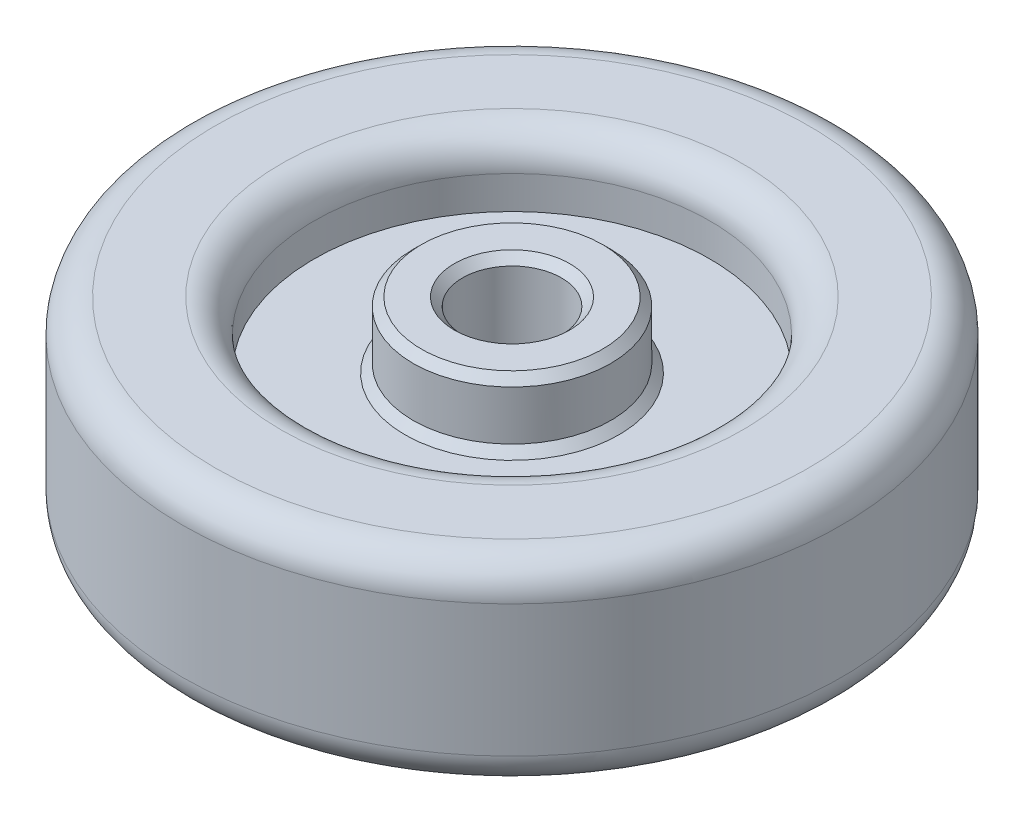
ISO-10303-21;
HEADER;
FILE_DESCRIPTION(('STEP AP214'),'2;1');
FILE_NAME('part.step','',(''),(''),'','','');
FILE_SCHEMA(('AUTOMOTIVE_DESIGN { 1 0 10303 214 1 1 1 1 }'));
ENDSEC;
DATA;
#1=APPLICATION_CONTEXT('core data for automotive mechanical design processes');
#2=APPLICATION_PROTOCOL_DEFINITION('international standard','automotive_design',2000,#1);
#3=PRODUCT_CONTEXT('',#1,'mechanical');
#4=PRODUCT('Part','Part','',(#3));
#5=PRODUCT_RELATED_PRODUCT_CATEGORY('part','',(#4));
#6=PRODUCT_DEFINITION_FORMATION('','',#4);
#7=PRODUCT_DEFINITION_CONTEXT('part definition',#1,'design');
#8=PRODUCT_DEFINITION('design','',#6,#7);
#9=PRODUCT_DEFINITION_SHAPE('','',#8);
#10=(LENGTH_UNIT() NAMED_UNIT(*) SI_UNIT(.MILLI.,.METRE.));
#11=(NAMED_UNIT(*) PLANE_ANGLE_UNIT() SI_UNIT($,.RADIAN.));
#12=(NAMED_UNIT(*) SI_UNIT($,.STERADIAN.) SOLID_ANGLE_UNIT());
#13=UNCERTAINTY_MEASURE_WITH_UNIT(LENGTH_MEASURE(1.E-05),#10,'distance_accuracy_value','');
#14=(GEOMETRIC_REPRESENTATION_CONTEXT(3) GLOBAL_UNCERTAINTY_ASSIGNED_CONTEXT((#13)) GLOBAL_UNIT_ASSIGNED_CONTEXT((#10,
#11,#12)) REPRESENTATION_CONTEXT('',''));
#15=CARTESIAN_POINT('',(0.,0.,0.));
#16=DIRECTION('',(0.,0.,1.));
#17=DIRECTION('',(1.,0.,0.));
#18=AXIS2_PLACEMENT_3D('',#15,#16,#17);
#19=CARTESIAN_POINT('',(0.,9.525,0.));
#20=DIRECTION('',(0.,-1.,0.));
#21=DIRECTION('',(0.,0.,-1.));
#22=AXIS2_PLACEMENT_3D('',#19,#20,#21);
#23=CYLINDRICAL_SURFACE('',#22,15.875);
#24=CARTESIAN_POINT('',(0.,1.5875,0.));
#25=DIRECTION('',(0.,1.,0.));
#26=DIRECTION('',(0.,0.,1.));
#27=AXIS2_PLACEMENT_3D('',#24,#25,#26);
#28=CIRCLE('',#27,15.875);
#29=CARTESIAN_POINT('',(0.,1.5875,-15.875));
#30=VERTEX_POINT('',#29);
#31=EDGE_CURVE('E98',#30,#30,#28,.T.);
#32=CARTESIAN_POINT('',(0.,7.9375,0.));
#33=DIRECTION('',(0.,1.,0.));
#34=DIRECTION('',(0.,0.,1.));
#35=AXIS2_PLACEMENT_3D('',#32,#33,#34);
#36=CIRCLE('',#35,15.875);
#37=CARTESIAN_POINT('',(0.,7.9375,-15.875));
#38=VERTEX_POINT('',#37);
#39=EDGE_CURVE('E102',#38,#38,#36,.F.);
#40=CARTESIAN_POINT('',(0.,1.5875,-15.875));
#41=CARTESIAN_POINT('',(0.,1.65364583333333,-15.875));
#42=CARTESIAN_POINT('',(0.,1.71979166666666,-15.875));
#43=CARTESIAN_POINT('',(0.,1.85208333333333,-15.875));
#44=CARTESIAN_POINT('',(0.,1.91822916666666,-15.875));
#45=CARTESIAN_POINT('',(0.,2.05052083333333,-15.875));
#46=CARTESIAN_POINT('',(0.,2.11666666666666,-15.875));
#47=CARTESIAN_POINT('',(0.,2.24895833333333,-15.875));
#48=CARTESIAN_POINT('',(0.,2.31510416666666,-15.875));
#49=CARTESIAN_POINT('',(0.,2.44739583333333,-15.875));
#50=CARTESIAN_POINT('',(0.,2.51354166666666,-15.875));
#51=CARTESIAN_POINT('',(0.,2.64583333333333,-15.875));
#52=CARTESIAN_POINT('',(0.,2.71197916666667,-15.875));
#53=CARTESIAN_POINT('',(0.,2.84427083333333,-15.875));
#54=CARTESIAN_POINT('',(0.,2.91041666666667,-15.875));
#55=CARTESIAN_POINT('',(0.,3.04270833333333,-15.875));
#56=CARTESIAN_POINT('',(0.,3.10885416666666,-15.875));
#57=CARTESIAN_POINT('',(0.,3.24114583333333,-15.875));
#58=CARTESIAN_POINT('',(0.,3.30729166666666,-15.875));
#59=CARTESIAN_POINT('',(0.,3.43958333333333,-15.875));
#60=CARTESIAN_POINT('',(0.,3.50572916666666,-15.875));
#61=CARTESIAN_POINT('',(0.,3.63802083333333,-15.875));
#62=CARTESIAN_POINT('',(0.,3.70416666666667,-15.875));
#63=CARTESIAN_POINT('',(0.,3.83645833333333,-15.875));
#64=CARTESIAN_POINT('',(0.,3.90260416666667,-15.875));
#65=CARTESIAN_POINT('',(0.,4.03489583333333,-15.875));
#66=CARTESIAN_POINT('',(0.,4.10104166666667,-15.875));
#67=CARTESIAN_POINT('',(0.,4.23333333333333,-15.875));
#68=CARTESIAN_POINT('',(0.,4.29947916666667,-15.875));
#69=CARTESIAN_POINT('',(0.,4.43177083333333,-15.875));
#70=CARTESIAN_POINT('',(0.,4.49791666666667,-15.875));
#71=CARTESIAN_POINT('',(0.,4.63020833333333,-15.875));
#72=CARTESIAN_POINT('',(0.,4.69635416666667,-15.875));
#73=CARTESIAN_POINT('',(0.,4.82864583333333,-15.875));
#74=CARTESIAN_POINT('',(0.,4.89479166666667,-15.875));
#75=CARTESIAN_POINT('',(0.,5.02708333333333,-15.875));
#76=CARTESIAN_POINT('',(0.,5.09322916666667,-15.875));
#77=CARTESIAN_POINT('',(0.,5.22552083333333,-15.875));
#78=CARTESIAN_POINT('',(0.,5.29166666666667,-15.875));
#79=CARTESIAN_POINT('',(0.,5.42395833333333,-15.875));
#80=CARTESIAN_POINT('',(0.,5.49010416666667,-15.875));
#81=CARTESIAN_POINT('',(0.,5.62239583333333,-15.875));
#82=CARTESIAN_POINT('',(0.,5.68854166666666,-15.875));
#83=CARTESIAN_POINT('',(0.,5.82083333333333,-15.875));
#84=CARTESIAN_POINT('',(0.,5.88697916666666,-15.875));
#85=CARTESIAN_POINT('',(0.,6.01927083333333,-15.875));
#86=CARTESIAN_POINT('',(0.,6.08541666666667,-15.875));
#87=CARTESIAN_POINT('',(0.,6.21770833333333,-15.875));
#88=CARTESIAN_POINT('',(0.,6.28385416666667,-15.875));
#89=CARTESIAN_POINT('',(0.,6.41614583333333,-15.875));
#90=CARTESIAN_POINT('',(0.,6.48229166666667,-15.875));
#91=CARTESIAN_POINT('',(0.,6.61458333333333,-15.875));
#92=CARTESIAN_POINT('',(0.,6.68072916666666,-15.875));
#93=CARTESIAN_POINT('',(0.,6.81302083333333,-15.875));
#94=CARTESIAN_POINT('',(0.,6.87916666666666,-15.875));
#95=CARTESIAN_POINT('',(0.,7.01145833333333,-15.875));
#96=CARTESIAN_POINT('',(0.,7.07760416666667,-15.875));
#97=CARTESIAN_POINT('',(0.,7.20989583333333,-15.875));
#98=CARTESIAN_POINT('',(0.,7.27604166666667,-15.875));
#99=CARTESIAN_POINT('',(0.,7.40833333333333,-15.875));
#100=CARTESIAN_POINT('',(0.,7.47447916666667,-15.875));
#101=CARTESIAN_POINT('',(0.,7.60677083333333,-15.875));
#102=CARTESIAN_POINT('',(0.,7.67291666666667,-15.875));
#103=CARTESIAN_POINT('',(0.,7.80520833333333,-15.875));
#104=CARTESIAN_POINT('',(0.,7.87135416666667,-15.875));
#105=CARTESIAN_POINT('',(0.,7.9375,-15.875));
#106=B_SPLINE_CURVE_WITH_KNOTS('',3,(#40,#41,#42,#43,#44,#45,#46,#47,#48,#49,#50,#51,#52,#53,
#54,#55,#56,#57,#58,#59,#60,#61,#62,#63,#64,#65,#66,#67,#68,#69,#70,#71,#72,#73,#74,#75,#76,#77,
#78,#79,#80,#81,#82,#83,#84,#85,#86,#87,#88,#89,#90,#91,#92,#93,#94,#95,#96,#97,#98,#99,#100,
#101,#102,#103,#104,#105),.UNSPECIFIED.,.F.,.F.,(4,2,2,2,2,2,2,2,2,2,2,2,2,2,2,2,2,2,2,2,2,2,2,
2,2,2,2,2,2,2,2,2,4),(0.,0.198437499999999,0.396874999999999,0.595312499999999,
0.793749999999999,0.992187499999999,1.190625,1.3890625,1.5875,1.7859375,1.984375,2.1828125,
2.38125,2.5796875,2.778125,2.9765625,3.175,3.3734375,3.571875,3.7703125,3.96875,4.1671875,
4.365625,4.5640625,4.7625,4.9609375,5.159375,5.3578125,5.55625,5.7546875,5.953125,6.1515625,
6.35),.UNSPECIFIED.);
#107=EDGE_CURVE('BSEAM41',#30,#38,#106,.T.);
#108=ORIENTED_EDGE('',*,*,#31,.T.);
#109=ORIENTED_EDGE('',*,*,#39,.T.);
#110=ORIENTED_EDGE('',*,*,#107,.T.);
#111=ORIENTED_EDGE('',*,*,#107,.F.);
#112=EDGE_LOOP('',(#108,#110,#109,#111));
#113=FACE_BOUND('',#112,.T.);
#114=ADVANCED_FACE('F41',(#113),#23,.T.);
#115=CARTESIAN_POINT('',(0.,9.525,0.));
#116=DIRECTION('',(0.,1.,0.));
#117=DIRECTION('',(0.,0.,1.));
#118=AXIS2_PLACEMENT_3D('',#115,#116,#117);
#119=PLANE('',#118);
#120=CARTESIAN_POINT('',(0.,9.525,0.));
#121=DIRECTION('',(0.,1.,0.));
#122=DIRECTION('',(0.,0.,1.));
#123=AXIS2_PLACEMENT_3D('',#120,#121,#122);
#124=CIRCLE('',#123,14.2875);
#125=CARTESIAN_POINT('',(0.,9.525,14.2875));
#126=VERTEX_POINT('',#125);
#127=EDGE_CURVE('E86',#126,#126,#124,.T.);
#128=ORIENTED_EDGE('',*,*,#127,.T.);
#129=EDGE_LOOP('',(#128));
#130=FACE_BOUND('',#129,.T.);
#131=CARTESIAN_POINT('',(0.,9.525,0.));
#132=DIRECTION('',(0.,1.,0.));
#133=DIRECTION('',(0.,0.,1.));
#134=AXIS2_PLACEMENT_3D('',#131,#132,#133);
#135=CIRCLE('',#134,11.1125);
#136=CARTESIAN_POINT('',(0.,9.525,11.1125));
#137=VERTEX_POINT('',#136);
#138=EDGE_CURVE('E90',#137,#137,#135,.F.);
#139=ORIENTED_EDGE('',*,*,#138,.T.);
#140=EDGE_LOOP('',(#139));
#141=FACE_BOUND('',#140,.T.);
#142=ADVANCED_FACE('F124',(#130,#141),#119,.T.);
#143=CARTESIAN_POINT('',(0.,0.,0.));
#144=DIRECTION('',(0.,1.,0.));
#145=DIRECTION('',(0.,0.,1.));
#146=AXIS2_PLACEMENT_3D('',#143,#144,#145);
#147=PLANE('',#146);
#148=CARTESIAN_POINT('',(0.,0.,0.));
#149=DIRECTION('',(0.,1.,0.));
#150=DIRECTION('',(0.,0.,1.));
#151=AXIS2_PLACEMENT_3D('',#148,#149,#150);
#152=CIRCLE('',#151,2.77812499999999);
#153=CARTESIAN_POINT('',(0.,0.,2.77812499999999));
#154=VERTEX_POINT('',#153);
#155=EDGE_CURVE('E78',#154,#154,#152,.T.);
#156=ORIENTED_EDGE('',*,*,#155,.T.);
#157=EDGE_LOOP('',(#156));
#158=FACE_BOUND('',#157,.T.);
#159=CARTESIAN_POINT('',(0.,0.,0.));
#160=DIRECTION('',(0.,1.,0.));
#161=DIRECTION('',(0.,0.,1.));
#162=AXIS2_PLACEMENT_3D('',#159,#160,#161);
#163=CIRCLE('',#162,14.2875);
#164=CARTESIAN_POINT('',(0.,0.,14.2875));
#165=VERTEX_POINT('',#164);
#166=EDGE_CURVE('E94',#165,#165,#163,.F.);
#167=ORIENTED_EDGE('',*,*,#166,.T.);
#168=EDGE_LOOP('',(#167));
#169=FACE_BOUND('',#168,.T.);
#170=ADVANCED_FACE('F115',(#158,#169),#147,.F.);
#171=CARTESIAN_POINT('',(0.,6.35,0.));
#172=DIRECTION('',(0.,1.,0.));
#173=DIRECTION('',(0.,0.,1.));
#174=AXIS2_PLACEMENT_3D('',#171,#172,#173);
#175=CYLINDRICAL_SURFACE('',#174,9.525);
#176=CARTESIAN_POINT('',(0.,7.9375,0.));
#177=DIRECTION('',(0.,1.,0.));
#178=DIRECTION('',(0.,0.,1.));
#179=AXIS2_PLACEMENT_3D('',#176,#177,#178);
#180=CIRCLE('',#179,9.525);
#181=CARTESIAN_POINT('',(0.,7.9375,9.525));
#182=VERTEX_POINT('',#181);
#183=EDGE_CURVE('E82',#182,#182,#180,.T.);
#184=ORIENTED_EDGE('',*,*,#183,.T.);
#185=EDGE_LOOP('',(#184));
#186=FACE_BOUND('',#185,.T.);
#187=CARTESIAN_POINT('',(0.,6.35,0.));
#188=DIRECTION('',(0.,1.,0.));
#189=DIRECTION('',(0.,0.,1.));
#190=AXIS2_PLACEMENT_3D('',#187,#188,#189);
#191=CIRCLE('',#190,9.525);
#192=CARTESIAN_POINT('',(0.,6.35,9.525));
#193=VERTEX_POINT('',#192);
#194=EDGE_CURVE('E106',#193,#193,#191,.T.);
#195=ORIENTED_EDGE('',*,*,#194,.F.);
#196=EDGE_LOOP('',(#195));
#197=FACE_BOUND('',#196,.T.);
#198=ADVANCED_FACE('F113',(#186,#197),#175,.F.);
#199=CARTESIAN_POINT('',(0.,6.35,0.));
#200=DIRECTION('',(0.,1.,0.));
#201=DIRECTION('',(0.,0.,1.));
#202=AXIS2_PLACEMENT_3D('',#199,#200,#201);
#203=PLANE('',#202);
#204=CARTESIAN_POINT('',(0.,6.35,0.));
#205=DIRECTION('',(0.,1.,0.));
#206=DIRECTION('',(0.,0.,1.));
#207=AXIS2_PLACEMENT_3D('',#204,#205,#206);
#208=CIRCLE('',#207,5.159375);
#209=CARTESIAN_POINT('',(0.,6.35,5.159375));
#210=VERTEX_POINT('',#209);
#211=EDGE_CURVE('E10',#210,#210,#208,.F.);
#212=ORIENTED_EDGE('',*,*,#211,.T.);
#213=EDGE_LOOP('',(#212));
#214=FACE_BOUND('',#213,.T.);
#215=ORIENTED_EDGE('',*,*,#194,.T.);
#216=EDGE_LOOP('',(#215));
#217=FACE_BOUND('',#216,.T.);
#218=ADVANCED_FACE('F111',(#214,#217),#203,.T.);
#219=CARTESIAN_POINT('',(0.,6.35,0.));
#220=DIRECTION('',(0.,1.,0.));
#221=DIRECTION('',(0.,0.,1.));
#222=AXIS2_PLACEMENT_3D('',#219,#220,#221);
#223=CYLINDRICAL_SURFACE('',#222,4.7625);
#224=CARTESIAN_POINT('',(0.,9.128125,0.));
#225=DIRECTION('',(0.,1.,0.));
#226=DIRECTION('',(0.,0.,1.));
#227=AXIS2_PLACEMENT_3D('',#224,#225,#226);
#228=CIRCLE('',#227,4.7625);
#229=CARTESIAN_POINT('',(0.,9.128125,-4.7625));
#230=VERTEX_POINT('',#229);
#231=EDGE_CURVE('E50',#230,#230,#228,.F.);
#232=ORIENTED_EDGE('',*,*,#231,.T.);
#233=EDGE_LOOP('',(#232));
#234=FACE_BOUND('',#233,.T.);
#235=CARTESIAN_POINT('',(0.,6.746875,0.));
#236=DIRECTION('',(0.,1.,0.));
#237=DIRECTION('',(0.,0.,1.));
#238=AXIS2_PLACEMENT_3D('',#235,#236,#237);
#239=CIRCLE('',#238,4.7625);
#240=CARTESIAN_POINT('',(0.,6.746875,4.7625));
#241=VERTEX_POINT('',#240);
#242=EDGE_CURVE('E55',#241,#241,#239,.T.);
#243=ORIENTED_EDGE('',*,*,#242,.T.);
#244=EDGE_LOOP('',(#243));
#245=FACE_BOUND('',#244,.T.);
#246=ADVANCED_FACE('F122',(#234,#245),#223,.T.);
#247=CARTESIAN_POINT('',(0.,9.525,0.));
#248=DIRECTION('',(0.,1.,0.));
#249=DIRECTION('',(0.,0.,1.));
#250=AXIS2_PLACEMENT_3D('',#247,#248,#249);
#251=CIRCLE('',#250,2.77812500000001);
#252=CARTESIAN_POINT('',(0.,9.525,2.77812500000001));
#253=VERTEX_POINT('',#252);
#254=EDGE_CURVE('E60',#253,#253,#251,.F.);
#255=ORIENTED_EDGE('',*,*,#254,.T.);
#256=EDGE_LOOP('',(#255));
#257=FACE_BOUND('',#256,.T.);
#258=CARTESIAN_POINT('',(0.,9.525,0.));
#259=DIRECTION('',(0.,1.,0.));
#260=DIRECTION('',(0.,0.,1.));
#261=AXIS2_PLACEMENT_3D('',#258,#259,#260);
#262=CIRCLE('',#261,4.365625);
#263=CARTESIAN_POINT('',(0.,9.525,-4.365625));
#264=VERTEX_POINT('',#263);
#265=EDGE_CURVE('E66',#264,#264,#262,.T.);
#266=ORIENTED_EDGE('',*,*,#265,.T.);
#267=EDGE_LOOP('',(#266));
#268=FACE_BOUND('',#267,.T.);
#269=ADVANCED_FACE('F135',(#257,#268),#119,.T.);
#270=CARTESIAN_POINT('',(0.,0.,0.));
#271=DIRECTION('',(0.,1.,0.));
#272=DIRECTION('',(0.,0.,1.));
#273=AXIS2_PLACEMENT_3D('',#270,#271,#272);
#274=CYLINDRICAL_SURFACE('',#273,2.38125);
#275=CARTESIAN_POINT('',(0.,0.396874999999984,0.));
#276=DIRECTION('',(0.,1.,0.));
#277=DIRECTION('',(0.,0.,1.));
#278=AXIS2_PLACEMENT_3D('',#275,#276,#277);
#279=CIRCLE('',#278,2.38125);
#280=CARTESIAN_POINT('',(0.,0.396874999999984,2.38125));
#281=VERTEX_POINT('',#280);
#282=EDGE_CURVE('E70',#281,#281,#279,.F.);
#283=CARTESIAN_POINT('',(0.,9.12812499999998,0.));
#284=DIRECTION('',(0.,1.,0.));
#285=DIRECTION('',(0.,0.,1.));
#286=AXIS2_PLACEMENT_3D('',#283,#284,#285);
#287=CIRCLE('',#286,2.38125);
#288=CARTESIAN_POINT('',(0.,9.12812499999998,2.38125));
#289=VERTEX_POINT('',#288);
#290=EDGE_CURVE('E74',#289,#289,#287,.T.);
#291=CARTESIAN_POINT('',(0.,0.396874999999984,2.38125));
#292=CARTESIAN_POINT('',(0.,0.487825520833317,2.38125));
#293=CARTESIAN_POINT('',(0.,0.578776041666651,2.38125));
#294=CARTESIAN_POINT('',(0.,0.760677083333317,2.38125));
#295=CARTESIAN_POINT('',(0.,0.851627604166651,2.38125));
#296=CARTESIAN_POINT('',(0.,1.03352864583332,2.38125));
#297=CARTESIAN_POINT('',(0.,1.12447916666665,2.38125));
#298=CARTESIAN_POINT('',(0.,1.30638020833332,2.38125));
#299=CARTESIAN_POINT('',(0.,1.39733072916665,2.38125));
#300=CARTESIAN_POINT('',(0.,1.57923177083332,2.38125));
#301=CARTESIAN_POINT('',(0.,1.67018229166665,2.38125));
#302=CARTESIAN_POINT('',(0.,1.85208333333332,2.38125));
#303=CARTESIAN_POINT('',(0.,1.94303385416665,2.38125));
#304=CARTESIAN_POINT('',(0.,2.12493489583332,2.38125));
#305=CARTESIAN_POINT('',(0.,2.21588541666665,2.38125));
#306=CARTESIAN_POINT('',(0.,2.39778645833332,2.38125));
#307=CARTESIAN_POINT('',(0.,2.48873697916665,2.38125));
#308=CARTESIAN_POINT('',(0.,2.67063802083332,2.38125));
#309=CARTESIAN_POINT('',(0.,2.76158854166665,2.38125));
#310=CARTESIAN_POINT('',(0.,2.94348958333332,2.38125));
#311=CARTESIAN_POINT('',(0.,3.03444010416665,2.38125));
#312=CARTESIAN_POINT('',(0.,3.21634114583332,2.38125));
#313=CARTESIAN_POINT('',(0.,3.30729166666665,2.38125));
#314=CARTESIAN_POINT('',(0.,3.48919270833332,2.38125));
#315=CARTESIAN_POINT('',(0.,3.58014322916665,2.38125));
#316=CARTESIAN_POINT('',(0.,3.76204427083332,2.38125));
#317=CARTESIAN_POINT('',(0.,3.85299479166665,2.38125));
#318=CARTESIAN_POINT('',(0.,4.03489583333332,2.38125));
#319=CARTESIAN_POINT('',(0.,4.12584635416665,2.38125));
#320=CARTESIAN_POINT('',(0.,4.30774739583332,2.38125));
#321=CARTESIAN_POINT('',(0.,4.39869791666665,2.38125));
#322=CARTESIAN_POINT('',(0.,4.58059895833332,2.38125));
#323=CARTESIAN_POINT('',(0.,4.67154947916665,2.38125));
#324=CARTESIAN_POINT('',(0.,4.85345052083332,2.38125));
#325=CARTESIAN_POINT('',(0.,4.94440104166665,2.38125));
#326=CARTESIAN_POINT('',(0.,5.12630208333332,2.38125));
#327=CARTESIAN_POINT('',(0.,5.21725260416665,2.38125));
#328=CARTESIAN_POINT('',(0.,5.39915364583332,2.38125));
#329=CARTESIAN_POINT('',(0.,5.49010416666665,2.38125));
#330=CARTESIAN_POINT('',(0.,5.67200520833332,2.38125));
#331=CARTESIAN_POINT('',(0.,5.76295572916665,2.38125));
#332=CARTESIAN_POINT('',(0.,5.94485677083332,2.38125));
#333=CARTESIAN_POINT('',(0.,6.03580729166665,2.38125));
#334=CARTESIAN_POINT('',(0.,6.21770833333332,2.38125));
#335=CARTESIAN_POINT('',(0.,6.30865885416665,2.38125));
#336=CARTESIAN_POINT('',(0.,6.49055989583332,2.38125));
#337=CARTESIAN_POINT('',(0.,6.58151041666665,2.38125));
#338=CARTESIAN_POINT('',(0.,6.76341145833332,2.38125));
#339=CARTESIAN_POINT('',(0.,6.85436197916665,2.38125));
#340=CARTESIAN_POINT('',(0.,7.03626302083332,2.38125));
#341=CARTESIAN_POINT('',(0.,7.12721354166665,2.38125));
#342=CARTESIAN_POINT('',(0.,7.30911458333332,2.38125));
#343=CARTESIAN_POINT('',(0.,7.40006510416665,2.38125));
#344=CARTESIAN_POINT('',(0.,7.58196614583332,2.38125));
#345=CARTESIAN_POINT('',(0.,7.67291666666665,2.38125));
#346=CARTESIAN_POINT('',(0.,7.85481770833332,2.38125));
#347=CARTESIAN_POINT('',(0.,7.94576822916665,2.38125));
#348=CARTESIAN_POINT('',(0.,8.12766927083331,2.38125));
#349=CARTESIAN_POINT('',(0.,8.21861979166665,2.38125));
#350=CARTESIAN_POINT('',(0.,8.40052083333332,2.38125));
#351=CARTESIAN_POINT('',(0.,8.49147135416665,2.38125));
#352=CARTESIAN_POINT('',(0.,8.67337239583332,2.38125));
#353=CARTESIAN_POINT('',(0.,8.76432291666665,2.38125));
#354=CARTESIAN_POINT('',(0.,8.94622395833331,2.38125));
#355=CARTESIAN_POINT('',(0.,9.03717447916665,2.38125));
#356=CARTESIAN_POINT('',(0.,9.12812499999998,2.38125));
#357=B_SPLINE_CURVE_WITH_KNOTS('',3,(#291,#292,#293,#294,#295,#296,#297,#298,#299,#300,#301,
#302,#303,#304,#305,#306,#307,#308,#309,#310,#311,#312,#313,#314,#315,#316,#317,#318,#319,#320,
#321,#322,#323,#324,#325,#326,#327,#328,#329,#330,#331,#332,#333,#334,#335,#336,#337,#338,#339,
#340,#341,#342,#343,#344,#345,#346,#347,#348,#349,#350,#351,#352,#353,#354,#355,#356),
.UNSPECIFIED.,.F.,.F.,(4,2,2,2,2,2,2,2,2,2,2,2,2,2,2,2,2,2,2,2,2,2,2,2,2,2,2,2,2,2,2,2,4),(0.,
0.2728515625,0.545703125,0.8185546875,1.09140625,1.3642578125,1.637109375,1.9099609375,
2.1828125,2.4556640625,2.728515625,3.0013671875,3.27421875,3.5470703125,3.819921875,
4.0927734375,4.365625,4.6384765625,4.911328125,5.1841796875,5.45703125,5.7298828125,6.002734375,
6.2755859375,6.5484375,6.8212890625,7.094140625,7.3669921875,7.63984375,7.9126953125,
8.185546875,8.4583984375,8.73125),.UNSPECIFIED.);
#358=EDGE_CURVE('BSEAM142',#281,#289,#357,.T.);
#359=ORIENTED_EDGE('',*,*,#282,.T.);
#360=ORIENTED_EDGE('',*,*,#290,.T.);
#361=ORIENTED_EDGE('',*,*,#358,.T.);
#362=ORIENTED_EDGE('',*,*,#358,.F.);
#363=EDGE_LOOP('',(#359,#361,#360,#362));
#364=FACE_BOUND('',#363,.T.);
#365=ADVANCED_FACE('F142',(#364),#274,.F.);
#366=CARTESIAN_POINT('',(0.,1.5875,0.));
#367=DIRECTION('',(0.,1.,0.));
#368=DIRECTION('',(0.,0.,1.));
#369=AXIS2_PLACEMENT_3D('',#366,#367,#368);
#370=TOROIDAL_SURFACE('',#369,14.2875,1.5875);
#371=ORIENTED_EDGE('',*,*,#166,.F.);
#372=EDGE_LOOP('',(#371));
#373=FACE_BOUND('',#372,.T.);
#374=ORIENTED_EDGE('',*,*,#31,.F.);
#375=EDGE_LOOP('',(#374));
#376=FACE_BOUND('',#375,.T.);
#377=ADVANCED_FACE('F138',(#373,#376),#370,.T.);
#378=CARTESIAN_POINT('',(0.,7.9375,0.));
#379=DIRECTION('',(0.,1.,0.));
#380=DIRECTION('',(0.,0.,1.));
#381=AXIS2_PLACEMENT_3D('',#378,#379,#380);
#382=TOROIDAL_SURFACE('',#381,14.2875,1.5875);
#383=ORIENTED_EDGE('',*,*,#39,.F.);
#384=EDGE_LOOP('',(#383));
#385=FACE_BOUND('',#384,.T.);
#386=ORIENTED_EDGE('',*,*,#127,.F.);
#387=EDGE_LOOP('',(#386));
#388=FACE_BOUND('',#387,.T.);
#389=ADVANCED_FACE('F141',(#385,#388),#382,.T.);
#390=CARTESIAN_POINT('',(0.,7.9375,0.));
#391=DIRECTION('',(0.,1.,0.));
#392=DIRECTION('',(0.,0.,1.));
#393=AXIS2_PLACEMENT_3D('',#390,#391,#392);
#394=TOROIDAL_SURFACE('',#393,11.1125,1.5875);
#395=ORIENTED_EDGE('',*,*,#138,.F.);
#396=EDGE_LOOP('',(#395));
#397=FACE_BOUND('',#396,.T.);
#398=ORIENTED_EDGE('',*,*,#183,.F.);
#399=EDGE_LOOP('',(#398));
#400=FACE_BOUND('',#399,.T.);
#401=ADVANCED_FACE('F146',(#397,#400),#394,.T.);
#402=CARTESIAN_POINT('',(0.,0.,0.));
#403=DIRECTION('',(0.,-1.,0.));
#404=DIRECTION('',(0.,0.,-1.));
#405=AXIS2_PLACEMENT_3D('',#402,#403,#404);
#406=CONICAL_SURFACE('',#405,2.77812499999999,0.785398163397449);
#407=ORIENTED_EDGE('',*,*,#282,.F.);
#408=EDGE_LOOP('',(#407));
#409=FACE_BOUND('',#408,.T.);
#410=ORIENTED_EDGE('',*,*,#155,.F.);
#411=EDGE_LOOP('',(#410));
#412=FACE_BOUND('',#411,.T.);
#413=ADVANCED_FACE('F150',(#409,#412),#406,.F.);
#414=CARTESIAN_POINT('',(0.,9.12812499999998,0.));
#415=DIRECTION('',(0.,1.,0.));
#416=DIRECTION('',(0.,0.,1.));
#417=AXIS2_PLACEMENT_3D('',#414,#415,#416);
#418=CONICAL_SURFACE('',#417,2.38125,0.785398163397441);
#419=ORIENTED_EDGE('',*,*,#254,.F.);
#420=EDGE_LOOP('',(#419));
#421=FACE_BOUND('',#420,.T.);
#422=ORIENTED_EDGE('',*,*,#290,.F.);
#423=EDGE_LOOP('',(#422));
#424=FACE_BOUND('',#423,.T.);
#425=ADVANCED_FACE('F158',(#421,#424),#418,.F.);
#426=CARTESIAN_POINT('',(0.,9.525,0.));
#427=DIRECTION('',(0.,-1.,0.));
#428=DIRECTION('',(0.,0.,-1.));
#429=AXIS2_PLACEMENT_3D('',#426,#427,#428);
#430=CONICAL_SURFACE('',#429,4.365625,0.785398163397449);
#431=CARTESIAN_POINT('',(0.,9.128125,-4.7625));
#432=CARTESIAN_POINT('',(0.,9.13225911458333,-4.75836588541667));
#433=CARTESIAN_POINT('',(0.,9.13639322916666,-4.75423177083333));
#434=CARTESIAN_POINT('',(0.,9.14466145833333,-4.74596354166667));
#435=CARTESIAN_POINT('',(0.,9.14879557291667,-4.74182942708333));
#436=CARTESIAN_POINT('',(0.,9.15706380208333,-4.73356119791667));
#437=CARTESIAN_POINT('',(0.,9.16119791666667,-4.72942708333333));
#438=CARTESIAN_POINT('',(0.,9.16946614583333,-4.72115885416667));
#439=CARTESIAN_POINT('',(0.,9.17360026041666,-4.71702473958333));
#440=CARTESIAN_POINT('',(0.,9.18186848958333,-4.70875651041667));
#441=CARTESIAN_POINT('',(0.,9.18600260416667,-4.70462239583333));
#442=CARTESIAN_POINT('',(0.,9.19427083333333,-4.69635416666667));
#443=CARTESIAN_POINT('',(0.,9.19840494791667,-4.69222005208333));
#444=CARTESIAN_POINT('',(0.,9.20667317708333,-4.68395182291667));
#445=CARTESIAN_POINT('',(0.,9.21080729166667,-4.67981770833333));
#446=CARTESIAN_POINT('',(0.,9.21907552083333,-4.67154947916667));
#447=CARTESIAN_POINT('',(0.,9.22320963541667,-4.66741536458333));
#448=CARTESIAN_POINT('',(0.,9.23147786458333,-4.65914713541667));
#449=CARTESIAN_POINT('',(0.,9.23561197916667,-4.65501302083333));
#450=CARTESIAN_POINT('',(0.,9.24388020833333,-4.64674479166667));
#451=CARTESIAN_POINT('',(0.,9.24801432291666,-4.64261067708333));
#452=CARTESIAN_POINT('',(0.,9.25628255208333,-4.63434244791667));
#453=CARTESIAN_POINT('',(0.,9.26041666666666,-4.63020833333333));
#454=CARTESIAN_POINT('',(0.,9.26868489583333,-4.62194010416667));
#455=CARTESIAN_POINT('',(0.,9.27281901041667,-4.61780598958333));
#456=CARTESIAN_POINT('',(0.,9.28108723958333,-4.60953776041667));
#457=CARTESIAN_POINT('',(0.,9.28522135416666,-4.60540364583333));
#458=CARTESIAN_POINT('',(0.,9.29348958333333,-4.59713541666667));
#459=CARTESIAN_POINT('',(0.,9.29762369791666,-4.59300130208333));
#460=CARTESIAN_POINT('',(0.,9.30589192708333,-4.58473307291667));
#461=CARTESIAN_POINT('',(0.,9.31002604166667,-4.58059895833333));
#462=CARTESIAN_POINT('',(0.,9.31829427083333,-4.57233072916667));
#463=CARTESIAN_POINT('',(0.,9.32242838541667,-4.56819661458333));
#464=CARTESIAN_POINT('',(0.,9.33069661458333,-4.55992838541667));
#465=CARTESIAN_POINT('',(0.,9.33483072916667,-4.55579427083333));
#466=CARTESIAN_POINT('',(0.,9.34309895833333,-4.54752604166667));
#467=CARTESIAN_POINT('',(0.,9.34723307291667,-4.54339192708333));
#468=CARTESIAN_POINT('',(0.,9.35550130208333,-4.53512369791667));
#469=CARTESIAN_POINT('',(0.,9.35963541666667,-4.53098958333333));
#470=CARTESIAN_POINT('',(0.,9.36790364583333,-4.52272135416667));
#471=CARTESIAN_POINT('',(0.,9.37203776041667,-4.51858723958333));
#472=CARTESIAN_POINT('',(0.,9.38030598958333,-4.51031901041667));
#473=CARTESIAN_POINT('',(0.,9.38444010416667,-4.50618489583333));
#474=CARTESIAN_POINT('',(0.,9.39270833333333,-4.49791666666667));
#475=CARTESIAN_POINT('',(0.,9.39684244791667,-4.49378255208333));
#476=CARTESIAN_POINT('',(0.,9.40511067708333,-4.48551432291667));
#477=CARTESIAN_POINT('',(0.,9.40924479166667,-4.48138020833333));
#478=CARTESIAN_POINT('',(0.,9.41751302083333,-4.47311197916667));
#479=CARTESIAN_POINT('',(0.,9.42164713541667,-4.46897786458333));
#480=CARTESIAN_POINT('',(0.,9.42991536458333,-4.46070963541667));
#481=CARTESIAN_POINT('',(0.,9.43404947916667,-4.45657552083333));
#482=CARTESIAN_POINT('',(0.,9.44231770833333,-4.44830729166667));
#483=CARTESIAN_POINT('',(0.,9.44645182291666,-4.44417317708333));
#484=CARTESIAN_POINT('',(0.,9.45472005208333,-4.43590494791667));
#485=CARTESIAN_POINT('',(0.,9.45885416666667,-4.43177083333333));
#486=CARTESIAN_POINT('',(0.,9.46712239583333,-4.42350260416667));
#487=CARTESIAN_POINT('',(0.,9.47125651041667,-4.41936848958333));
#488=CARTESIAN_POINT('',(0.,9.47952473958333,-4.41110026041667));
#489=CARTESIAN_POINT('',(0.,9.48365885416666,-4.40696614583333));
#490=CARTESIAN_POINT('',(0.,9.49192708333333,-4.39869791666667));
#491=CARTESIAN_POINT('',(0.,9.49606119791667,-4.39456380208333));
#492=CARTESIAN_POINT('',(0.,9.50432942708333,-4.38629557291667));
#493=CARTESIAN_POINT('',(0.,9.50846354166667,-4.38216145833333));
#494=CARTESIAN_POINT('',(0.,9.51673177083333,-4.37389322916667));
#495=CARTESIAN_POINT('',(0.,9.52086588541667,-4.36975911458333));
#496=CARTESIAN_POINT('',(0.,9.525,-4.365625));
#497=B_SPLINE_CURVE_WITH_KNOTS('',3,(#431,#432,#433,#434,#435,#436,#437,#438,#439,#440,#441,
#442,#443,#444,#445,#446,#447,#448,#449,#450,#451,#452,#453,#454,#455,#456,#457,#458,#459,#460,
#461,#462,#463,#464,#465,#466,#467,#468,#469,#470,#471,#472,#473,#474,#475,#476,#477,#478,#479,
#480,#481,#482,#483,#484,#485,#486,#487,#488,#489,#490,#491,#492,#493,#494,#495,#496),
.UNSPECIFIED.,.F.,.F.,(4,2,2,2,2,2,2,2,2,2,2,2,2,2,2,2,2,2,2,2,2,2,2,2,2,2,2,2,2,2,2,2,4),(0.,
0.0175395627364622,0.0350791254729262,0.0526186882093896,0.0701582509458524,0.0876978136823158,
0.105237376418779,0.122776939155242,0.140316501891705,0.157856064628169,0.175395627364632,
0.192935190101095,0.210474752837559,0.228014315574021,0.245553878310485,0.263093441046949,
0.280633003783412,0.298172566519875,0.315712129256338,0.333251691992802,0.350791254729264,
0.368330817465728,0.385870380202192,0.403409942938654,0.420949505675118,0.438489068411581,
0.456028631148044,0.473568193884508,0.491107756620971,0.508647319357434,0.526186882093897,
0.543726444830361,0.561266007566825),.UNSPECIFIED.);
#498=EDGE_CURVE('BSEAM164',#230,#264,#497,.T.);
#499=ORIENTED_EDGE('',*,*,#231,.F.);
#500=ORIENTED_EDGE('',*,*,#265,.F.);
#501=ORIENTED_EDGE('',*,*,#498,.T.);
#502=ORIENTED_EDGE('',*,*,#498,.F.);
#503=EDGE_LOOP('',(#499,#501,#500,#502));
#504=FACE_BOUND('',#503,.T.);
#505=ADVANCED_FACE('F164',(#504),#430,.T.);
#506=CARTESIAN_POINT('',(0.,6.746875,0.));
#507=DIRECTION('',(0.,-1.,0.));
#508=DIRECTION('',(0.,0.,-1.));
#509=AXIS2_PLACEMENT_3D('',#506,#507,#508);
#510=CONICAL_SURFACE('',#509,4.7625,0.78539816339745);
#511=ORIENTED_EDGE('',*,*,#211,.F.);
#512=EDGE_LOOP('',(#511));
#513=FACE_BOUND('',#512,.T.);
#514=ORIENTED_EDGE('',*,*,#242,.F.);
#515=EDGE_LOOP('',(#514));
#516=FACE_BOUND('',#515,.T.);
#517=ADVANCED_FACE('F44',(#513,#516),#510,.T.);
#518=CLOSED_SHELL('',(#114,#142,#170,#198,#218,#246,#269,#365,#377,#389,#401,#413,#425,#505,#517));
#519=MANIFOLD_SOLID_BREP('B2',#518);
#520=ADVANCED_BREP_SHAPE_REPRESENTATION('',(#18,#519),#14);
#521=SHAPE_DEFINITION_REPRESENTATION(#9,#520);
ENDSEC;
END-ISO-10303-21;
